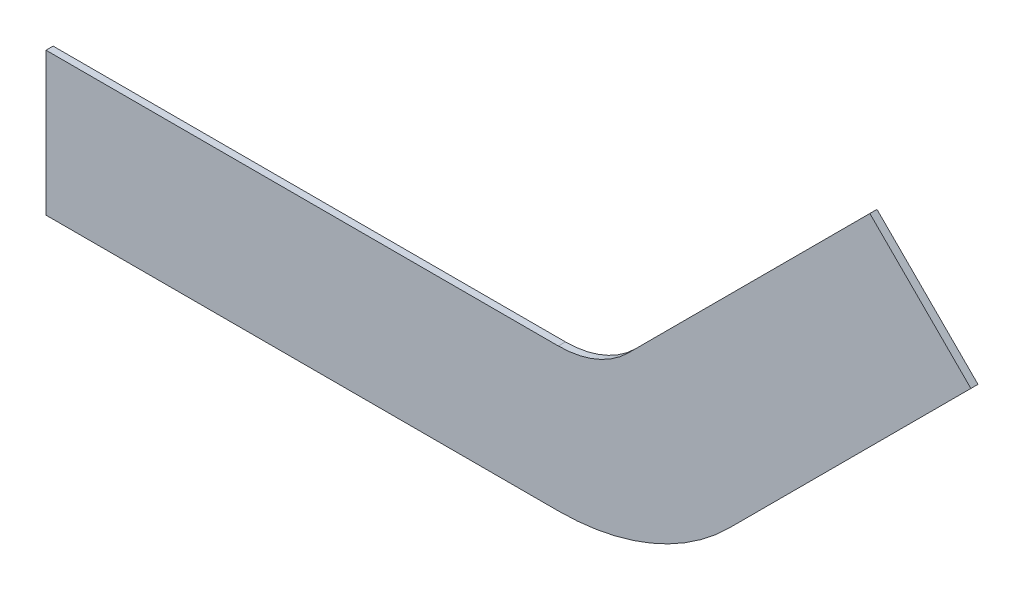
ISO-10303-21;
HEADER;
FILE_DESCRIPTION(('STEP AP214'),'2;1');
FILE_NAME('part.step','',(''),(''),'','','');
FILE_SCHEMA(('AUTOMOTIVE_DESIGN { 1 0 10303 214 1 1 1 1 }'));
ENDSEC;
DATA;
#1=APPLICATION_CONTEXT('core data for automotive mechanical design processes');
#2=APPLICATION_PROTOCOL_DEFINITION('international standard','automotive_design',2000,#1);
#3=PRODUCT_CONTEXT('',#1,'mechanical');
#4=PRODUCT('Part','Part','',(#3));
#5=PRODUCT_RELATED_PRODUCT_CATEGORY('part','',(#4));
#6=PRODUCT_DEFINITION_FORMATION('','',#4);
#7=PRODUCT_DEFINITION_CONTEXT('part definition',#1,'design');
#8=PRODUCT_DEFINITION('design','',#6,#7);
#9=PRODUCT_DEFINITION_SHAPE('','',#8);
#10=(LENGTH_UNIT() NAMED_UNIT(*) SI_UNIT(.MILLI.,.METRE.));
#11=(NAMED_UNIT(*) PLANE_ANGLE_UNIT() SI_UNIT($,.RADIAN.));
#12=(NAMED_UNIT(*) SI_UNIT($,.STERADIAN.) SOLID_ANGLE_UNIT());
#13=UNCERTAINTY_MEASURE_WITH_UNIT(LENGTH_MEASURE(1.E-05),#10,'distance_accuracy_value','');
#14=(GEOMETRIC_REPRESENTATION_CONTEXT(3) GLOBAL_UNCERTAINTY_ASSIGNED_CONTEXT((#13)) GLOBAL_UNIT_ASSIGNED_CONTEXT((#10,
#11,#12)) REPRESENTATION_CONTEXT('',''));
#15=CARTESIAN_POINT('',(0.,0.,0.));
#16=DIRECTION('',(0.,0.,1.));
#17=DIRECTION('',(1.,0.,0.));
#18=AXIS2_PLACEMENT_3D('',#15,#16,#17);
#19=CARTESIAN_POINT('',(0.,0.,3.175));
#20=DIRECTION('',(0.,-1.,0.));
#21=DIRECTION('',(0.,0.,-1.));
#22=AXIS2_PLACEMENT_3D('',#19,#20,#21);
#23=PLANE('',#22);
#24=DIRECTION('',(-1.,0.,0.));
#25=VECTOR('',#24,1.);
#26=CARTESIAN_POINT('',(0.,0.,0.));
#27=LINE('',#26,#25);
#28=CARTESIAN_POINT('',(228.6,0.,0.));
#29=VERTEX_POINT('',#28);
#30=CARTESIAN_POINT('',(0.,0.,0.));
#31=VERTEX_POINT('',#30);
#32=EDGE_CURVE('E144',#29,#31,#27,.T.);
#33=ORIENTED_EDGE('',*,*,#32,.T.);
#34=DIRECTION('',(0.,0.,-1.));
#35=VECTOR('',#34,1.);
#36=CARTESIAN_POINT('',(0.,0.,3.175));
#37=LINE('',#36,#35);
#38=CARTESIAN_POINT('',(0.,0.,3.175));
#39=VERTEX_POINT('',#38);
#40=EDGE_CURVE('E11',#39,#31,#37,.T.);
#41=ORIENTED_EDGE('',*,*,#40,.F.);
#42=DIRECTION('',(-1.,0.,0.));
#43=VECTOR('',#42,1.);
#44=CARTESIAN_POINT('',(0.,0.,3.175));
#45=LINE('',#44,#43);
#46=CARTESIAN_POINT('',(228.6,0.,3.175));
#47=VERTEX_POINT('',#46);
#48=EDGE_CURVE('E166',#47,#39,#45,.T.);
#49=ORIENTED_EDGE('',*,*,#48,.F.);
#50=DIRECTION('',(0.,0.,-1.));
#51=VECTOR('',#50,1.);
#52=CARTESIAN_POINT('',(228.6,0.,3.175));
#53=LINE('',#52,#51);
#54=EDGE_CURVE('E140',#47,#29,#53,.T.);
#55=ORIENTED_EDGE('',*,*,#54,.T.);
#56=EDGE_LOOP('',(#33,#41,#49,#55));
#57=FACE_BOUND('',#56,.T.);
#58=ADVANCED_FACE('F43',(#57),#23,.F.);
#59=CARTESIAN_POINT('',(0.,0.,3.175));
#60=DIRECTION('',(1.,0.,0.));
#61=DIRECTION('',(0.,1.,0.));
#62=AXIS2_PLACEMENT_3D('',#59,#60,#61);
#63=PLANE('',#62);
#64=DIRECTION('',(0.,-1.,0.));
#65=VECTOR('',#64,1.);
#66=CARTESIAN_POINT('',(0.,0.,0.));
#67=LINE('',#66,#65);
#68=CARTESIAN_POINT('',(0.,-63.754,0.));
#69=VERTEX_POINT('',#68);
#70=EDGE_CURVE('E148',#31,#69,#67,.T.);
#71=ORIENTED_EDGE('',*,*,#70,.T.);
#72=DIRECTION('',(0.,0.,-1.));
#73=VECTOR('',#72,1.);
#74=CARTESIAN_POINT('',(0.,-63.754,3.175));
#75=LINE('',#74,#73);
#76=CARTESIAN_POINT('',(0.,-63.754,3.175));
#77=VERTEX_POINT('',#76);
#78=EDGE_CURVE('E52',#77,#69,#75,.T.);
#79=ORIENTED_EDGE('',*,*,#78,.F.);
#80=DIRECTION('',(0.,-1.,0.));
#81=VECTOR('',#80,1.);
#82=CARTESIAN_POINT('',(0.,0.,3.175));
#83=LINE('',#82,#81);
#84=EDGE_CURVE('E103',#39,#77,#83,.T.);
#85=ORIENTED_EDGE('',*,*,#84,.F.);
#86=ORIENTED_EDGE('',*,*,#40,.T.);
#87=EDGE_LOOP('',(#71,#79,#85,#86));
#88=FACE_BOUND('',#87,.T.);
#89=ADVANCED_FACE('F212',(#88),#63,.F.);
#90=CARTESIAN_POINT('',(0.,-63.754,3.175));
#91=DIRECTION('',(0.,1.,0.));
#92=DIRECTION('',(0.,0.,1.));
#93=AXIS2_PLACEMENT_3D('',#90,#91,#92);
#94=PLANE('',#93);
#95=DIRECTION('',(1.,0.,0.));
#96=VECTOR('',#95,1.);
#97=CARTESIAN_POINT('',(0.,-63.754,0.));
#98=LINE('',#97,#96);
#99=CARTESIAN_POINT('',(228.6,-63.754,0.));
#100=VERTEX_POINT('',#99);
#101=EDGE_CURVE('E151',#69,#100,#98,.T.);
#102=ORIENTED_EDGE('',*,*,#101,.T.);
#103=DIRECTION('',(0.,0.,-1.));
#104=VECTOR('',#103,1.);
#105=CARTESIAN_POINT('',(228.6,-63.754,3.175));
#106=LINE('',#105,#104);
#107=CARTESIAN_POINT('',(228.6,-63.754,3.175));
#108=VERTEX_POINT('',#107);
#109=EDGE_CURVE('E177',#108,#100,#106,.T.);
#110=ORIENTED_EDGE('',*,*,#109,.F.);
#111=DIRECTION('',(1.,0.,0.));
#112=VECTOR('',#111,1.);
#113=CARTESIAN_POINT('',(0.,-63.754,3.175));
#114=LINE('',#113,#112);
#115=EDGE_CURVE('E187',#77,#108,#114,.T.);
#116=ORIENTED_EDGE('',*,*,#115,.F.);
#117=ORIENTED_EDGE('',*,*,#78,.T.);
#118=EDGE_LOOP('',(#102,#110,#116,#117));
#119=FACE_BOUND('',#118,.T.);
#120=ADVANCED_FACE('F185',(#119),#94,.F.);
#121=CARTESIAN_POINT('',(228.6,44.196,3.175));
#122=DIRECTION('',(0.,0.,-1.));
#123=DIRECTION('',(-1.,0.,0.));
#124=AXIS2_PLACEMENT_3D('',#121,#122,#123);
#125=CYLINDRICAL_SURFACE('',#124,107.95);
#126=CARTESIAN_POINT('',(228.6,44.196,0.));
#127=DIRECTION('',(0.,0.,1.));
#128=DIRECTION('',(1.,0.,0.));
#129=AXIS2_PLACEMENT_3D('',#126,#127,#128);
#130=CIRCLE('',#129,107.95);
#131=CARTESIAN_POINT('',(304.932177029088,-32.1361770290876,0.));
#132=VERTEX_POINT('',#131);
#133=EDGE_CURVE('E154',#100,#132,#130,.T.);
#134=ORIENTED_EDGE('',*,*,#133,.T.);
#135=DIRECTION('',(0.,0.,-1.));
#136=VECTOR('',#135,1.);
#137=CARTESIAN_POINT('',(304.932177029088,-32.1361770290876,3.175));
#138=LINE('',#137,#136);
#139=CARTESIAN_POINT('',(304.932177029088,-32.1361770290876,3.175));
#140=VERTEX_POINT('',#139);
#141=EDGE_CURVE('E173',#140,#132,#138,.T.);
#142=ORIENTED_EDGE('',*,*,#141,.F.);
#143=CARTESIAN_POINT('',(228.6,44.196,3.175));
#144=DIRECTION('',(0.,0.,1.));
#145=DIRECTION('',(1.,0.,0.));
#146=AXIS2_PLACEMENT_3D('',#143,#144,#145);
#147=CIRCLE('',#146,107.95);
#148=EDGE_CURVE('E200',#108,#140,#147,.T.);
#149=ORIENTED_EDGE('',*,*,#148,.F.);
#150=ORIENTED_EDGE('',*,*,#109,.T.);
#151=EDGE_LOOP('',(#134,#142,#149,#150));
#152=FACE_BOUND('',#151,.T.);
#153=ADVANCED_FACE('F195',(#152),#125,.T.);
#154=CARTESIAN_POINT('',(304.932177029088,-32.1361770290876,3.175));
#155=DIRECTION('',(-0.707106781186549,0.707106781186546,0.));
#156=DIRECTION('',(-0.707106781186546,-0.707106781186549,0.));
#157=AXIS2_PLACEMENT_3D('',#154,#155,#156);
#158=PLANE('',#157);
#159=DIRECTION('',(0.707106781186546,0.707106781186549,0.));
#160=VECTOR('',#159,1.);
#161=CARTESIAN_POINT('',(304.932177029088,-32.1361770290876,0.));
#162=LINE('',#161,#160);
#163=CARTESIAN_POINT('',(412.695250481918,75.6268964237425,0.));
#164=VERTEX_POINT('',#163);
#165=EDGE_CURVE('E157',#132,#164,#162,.T.);
#166=ORIENTED_EDGE('',*,*,#165,.T.);
#167=DIRECTION('',(0.,0.,-1.));
#168=VECTOR('',#167,1.);
#169=CARTESIAN_POINT('',(412.695250481918,75.6268964237425,3.175));
#170=LINE('',#169,#168);
#171=CARTESIAN_POINT('',(412.695250481918,75.6268964237425,3.175));
#172=VERTEX_POINT('',#171);
#173=EDGE_CURVE('E133',#172,#164,#170,.T.);
#174=ORIENTED_EDGE('',*,*,#173,.F.);
#175=DIRECTION('',(0.707106781186546,0.707106781186549,0.));
#176=VECTOR('',#175,1.);
#177=CARTESIAN_POINT('',(304.932177029088,-32.1361770290876,3.175));
#178=LINE('',#177,#176);
#179=EDGE_CURVE('E122',#140,#172,#178,.T.);
#180=ORIENTED_EDGE('',*,*,#179,.F.);
#181=ORIENTED_EDGE('',*,*,#141,.T.);
#182=EDGE_LOOP('',(#166,#174,#180,#181));
#183=FACE_BOUND('',#182,.T.);
#184=ADVANCED_FACE('F198',(#183),#158,.F.);
#185=CARTESIAN_POINT('',(412.695250481918,75.6268964237425,3.175));
#186=DIRECTION('',(-0.707106781186546,-0.707106781186549,0.));
#187=DIRECTION('',(0.707106781186549,-0.707106781186546,0.));
#188=AXIS2_PLACEMENT_3D('',#185,#186,#187);
#189=PLANE('',#188);
#190=DIRECTION('',(-0.707106781186549,0.707106781186546,0.));
#191=VECTOR('',#190,1.);
#192=CARTESIAN_POINT('',(412.695250481918,75.6268964237425,0.));
#193=LINE('',#192,#191);
#194=CARTESIAN_POINT('',(367.61436475415,120.707782151509,0.));
#195=VERTEX_POINT('',#194);
#196=EDGE_CURVE('E131',#164,#195,#193,.T.);
#197=ORIENTED_EDGE('',*,*,#196,.T.);
#198=DIRECTION('',(0.,0.,-1.));
#199=VECTOR('',#198,1.);
#200=CARTESIAN_POINT('',(367.61436475415,120.707782151509,3.175));
#201=LINE('',#200,#199);
#202=CARTESIAN_POINT('',(367.61436475415,120.707782151509,3.175));
#203=VERTEX_POINT('',#202);
#204=EDGE_CURVE('E128',#203,#195,#201,.T.);
#205=ORIENTED_EDGE('',*,*,#204,.F.);
#206=DIRECTION('',(-0.707106781186549,0.707106781186546,0.));
#207=VECTOR('',#206,1.);
#208=CARTESIAN_POINT('',(412.695250481918,75.6268964237425,3.175));
#209=LINE('',#208,#207);
#210=EDGE_CURVE('E116',#172,#203,#209,.T.);
#211=ORIENTED_EDGE('',*,*,#210,.F.);
#212=ORIENTED_EDGE('',*,*,#173,.T.);
#213=EDGE_LOOP('',(#197,#205,#211,#212));
#214=FACE_BOUND('',#213,.T.);
#215=ADVANCED_FACE('F129',(#214),#189,.F.);
#216=CARTESIAN_POINT('',(259.851291301321,12.9447086986794,3.175));
#217=DIRECTION('',(0.707106781186549,-0.707106781186546,0.));
#218=DIRECTION('',(0.707106781186546,0.707106781186549,0.));
#219=AXIS2_PLACEMENT_3D('',#216,#217,#218);
#220=PLANE('',#219);
#221=DIRECTION('',(-0.707106781186546,-0.707106781186549,0.));
#222=VECTOR('',#221,1.);
#223=CARTESIAN_POINT('',(259.851291301321,12.9447086986794,0.));
#224=LINE('',#223,#222);
#225=CARTESIAN_POINT('',(259.851291301321,12.9447086986794,0.));
#226=VERTEX_POINT('',#225);
#227=EDGE_CURVE('E89',#195,#226,#224,.T.);
#228=ORIENTED_EDGE('',*,*,#227,.T.);
#229=DIRECTION('',(0.,0.,-1.));
#230=VECTOR('',#229,1.);
#231=CARTESIAN_POINT('',(259.851291301321,12.9447086986794,3.175));
#232=LINE('',#231,#230);
#233=CARTESIAN_POINT('',(259.851291301321,12.9447086986794,3.175));
#234=VERTEX_POINT('',#233);
#235=EDGE_CURVE('E134',#234,#226,#232,.T.);
#236=ORIENTED_EDGE('',*,*,#235,.F.);
#237=DIRECTION('',(-0.707106781186546,-0.707106781186549,0.));
#238=VECTOR('',#237,1.);
#239=CARTESIAN_POINT('',(259.851291301321,12.9447086986794,3.175));
#240=LINE('',#239,#238);
#241=EDGE_CURVE('E120',#203,#234,#240,.T.);
#242=ORIENTED_EDGE('',*,*,#241,.F.);
#243=ORIENTED_EDGE('',*,*,#204,.T.);
#244=EDGE_LOOP('',(#228,#236,#242,#243));
#245=FACE_BOUND('',#244,.T.);
#246=ADVANCED_FACE('F136',(#245),#220,.F.);
#247=CARTESIAN_POINT('',(228.6,44.196,3.175));
#248=DIRECTION('',(0.,0.,-1.));
#249=DIRECTION('',(-1.,0.,0.));
#250=AXIS2_PLACEMENT_3D('',#247,#248,#249);
#251=CYLINDRICAL_SURFACE('',#250,44.196);
#252=CARTESIAN_POINT('',(228.6,44.196,0.));
#253=DIRECTION('',(0.,0.,-1.));
#254=DIRECTION('',(1.,0.,0.));
#255=AXIS2_PLACEMENT_3D('',#252,#253,#254);
#256=CIRCLE('',#255,44.196);
#257=EDGE_CURVE('E95',#226,#29,#256,.T.);
#258=ORIENTED_EDGE('',*,*,#257,.T.);
#259=ORIENTED_EDGE('',*,*,#54,.F.);
#260=CARTESIAN_POINT('',(228.6,44.196,3.175));
#261=DIRECTION('',(0.,0.,-1.));
#262=DIRECTION('',(1.,0.,0.));
#263=AXIS2_PLACEMENT_3D('',#260,#261,#262);
#264=CIRCLE('',#263,44.196);
#265=EDGE_CURVE('E60',#234,#47,#264,.T.);
#266=ORIENTED_EDGE('',*,*,#265,.F.);
#267=ORIENTED_EDGE('',*,*,#235,.T.);
#268=EDGE_LOOP('',(#258,#259,#266,#267));
#269=FACE_BOUND('',#268,.T.);
#270=ADVANCED_FACE('F228',(#269),#251,.F.);
#271=CARTESIAN_POINT('',(228.6,44.196,3.175));
#272=DIRECTION('',(0.,0.,1.));
#273=DIRECTION('',(1.,0.,0.));
#274=AXIS2_PLACEMENT_3D('',#271,#272,#273);
#275=PLANE('',#274);
#276=ORIENTED_EDGE('',*,*,#48,.T.);
#277=ORIENTED_EDGE('',*,*,#84,.T.);
#278=ORIENTED_EDGE('',*,*,#115,.T.);
#279=ORIENTED_EDGE('',*,*,#148,.T.);
#280=ORIENTED_EDGE('',*,*,#179,.T.);
#281=ORIENTED_EDGE('',*,*,#210,.T.);
#282=ORIENTED_EDGE('',*,*,#241,.T.);
#283=ORIENTED_EDGE('',*,*,#265,.T.);
#284=EDGE_LOOP('',(#276,#277,#278,#279,#280,#281,#282,#283));
#285=FACE_BOUND('',#284,.T.);
#286=ADVANCED_FACE('F118',(#285),#275,.T.);
#287=CARTESIAN_POINT('',(228.6,44.196,0.));
#288=DIRECTION('',(0.,0.,1.));
#289=DIRECTION('',(1.,0.,0.));
#290=AXIS2_PLACEMENT_3D('',#287,#288,#289);
#291=PLANE('',#290);
#292=ORIENTED_EDGE('',*,*,#32,.F.);
#293=ORIENTED_EDGE('',*,*,#257,.F.);
#294=ORIENTED_EDGE('',*,*,#227,.F.);
#295=ORIENTED_EDGE('',*,*,#196,.F.);
#296=ORIENTED_EDGE('',*,*,#165,.F.);
#297=ORIENTED_EDGE('',*,*,#133,.F.);
#298=ORIENTED_EDGE('',*,*,#101,.F.);
#299=ORIENTED_EDGE('',*,*,#70,.F.);
#300=EDGE_LOOP('',(#292,#293,#294,#295,#296,#297,#298,#299));
#301=FACE_BOUND('',#300,.T.);
#302=ADVANCED_FACE('F191',(#301),#291,.F.);
#303=CLOSED_SHELL('',(#58,#89,#120,#153,#184,#215,#246,#270,#286,#302));
#304=MANIFOLD_SOLID_BREP('B2',#303);
#305=ADVANCED_BREP_SHAPE_REPRESENTATION('',(#18,#304),#14);
#306=SHAPE_DEFINITION_REPRESENTATION(#9,#305);
ENDSEC;
END-ISO-10303-21;
